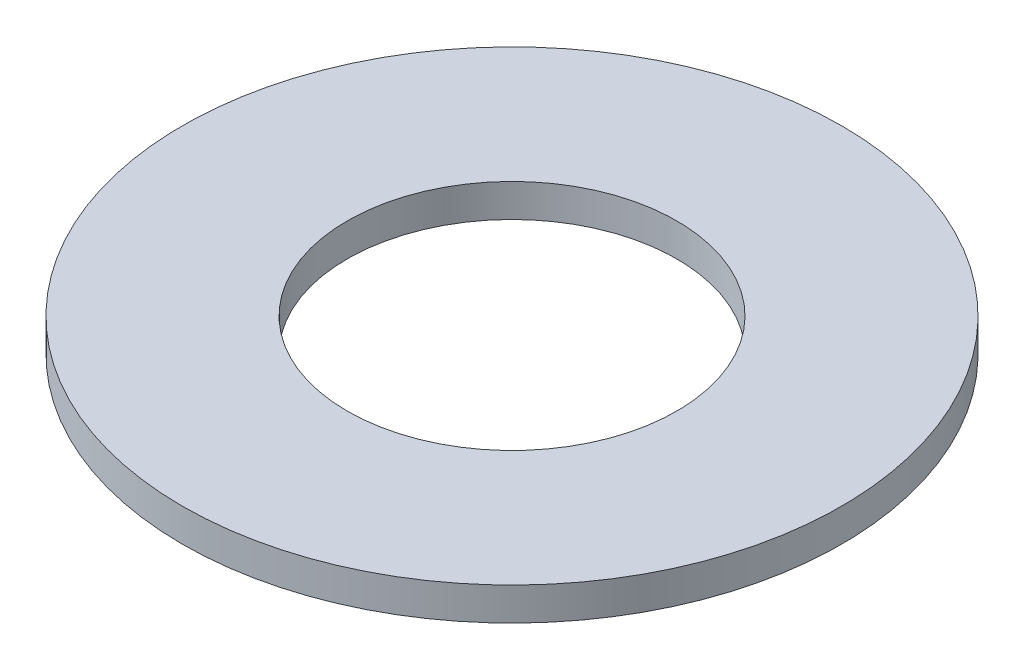
ISO-10303-21;
HEADER;
FILE_DESCRIPTION(('STEP AP214'),'2;1');
FILE_NAME('part.step','',(''),(''),'','','');
FILE_SCHEMA(('AUTOMOTIVE_DESIGN { 1 0 10303 214 1 1 1 1 }'));
ENDSEC;
DATA;
#1=APPLICATION_CONTEXT('core data for automotive mechanical design processes');
#2=APPLICATION_PROTOCOL_DEFINITION('international standard','automotive_design',2000,#1);
#3=PRODUCT_CONTEXT('',#1,'mechanical');
#4=PRODUCT('Part','Part','',(#3));
#5=PRODUCT_RELATED_PRODUCT_CATEGORY('part','',(#4));
#6=PRODUCT_DEFINITION_FORMATION('','',#4);
#7=PRODUCT_DEFINITION_CONTEXT('part definition',#1,'design');
#8=PRODUCT_DEFINITION('design','',#6,#7);
#9=PRODUCT_DEFINITION_SHAPE('','',#8);
#10=(LENGTH_UNIT() NAMED_UNIT(*) SI_UNIT(.MILLI.,.METRE.));
#11=(NAMED_UNIT(*) PLANE_ANGLE_UNIT() SI_UNIT($,.RADIAN.));
#12=(NAMED_UNIT(*) SI_UNIT($,.STERADIAN.) SOLID_ANGLE_UNIT());
#13=UNCERTAINTY_MEASURE_WITH_UNIT(LENGTH_MEASURE(1.E-05),#10,'distance_accuracy_value','');
#14=(GEOMETRIC_REPRESENTATION_CONTEXT(3) GLOBAL_UNCERTAINTY_ASSIGNED_CONTEXT((#13)) GLOBAL_UNIT_ASSIGNED_CONTEXT((#10,
#11,#12)) REPRESENTATION_CONTEXT('',''));
#15=CARTESIAN_POINT('',(0.,0.,0.));
#16=DIRECTION('',(0.,0.,1.));
#17=DIRECTION('',(1.,0.,0.));
#18=AXIS2_PLACEMENT_3D('',#15,#16,#17);
#19=CARTESIAN_POINT('',(0.,0.5,0.));
#20=DIRECTION('',(0.,1.,0.));
#21=DIRECTION('',(0.,0.,1.));
#22=AXIS2_PLACEMENT_3D('',#19,#20,#21);
#23=PLANE('',#22);
#24=CARTESIAN_POINT('',(0.,0.5,0.));
#25=DIRECTION('',(0.,1.,0.));
#26=DIRECTION('',(0.,0.,1.));
#27=AXIS2_PLACEMENT_3D('',#24,#25,#26);
#28=CIRCLE('',#27,5.);
#29=CARTESIAN_POINT('',(0.,0.5,5.));
#30=VERTEX_POINT('',#29);
#31=EDGE_CURVE('E10',#30,#30,#28,.T.);
#32=ORIENTED_EDGE('',*,*,#31,.T.);
#33=EDGE_LOOP('',(#32));
#34=FACE_BOUND('',#33,.T.);
#35=CARTESIAN_POINT('',(0.,0.5,0.));
#36=DIRECTION('',(0.,1.,0.));
#37=DIRECTION('',(0.,0.,1.));
#38=AXIS2_PLACEMENT_3D('',#35,#36,#37);
#39=CIRCLE('',#38,2.5);
#40=CARTESIAN_POINT('',(0.,0.5,2.5));
#41=VERTEX_POINT('',#40);
#42=EDGE_CURVE('E45',#41,#41,#39,.T.);
#43=ORIENTED_EDGE('',*,*,#42,.F.);
#44=EDGE_LOOP('',(#43));
#45=FACE_BOUND('',#44,.T.);
#46=ADVANCED_FACE('F34',(#34,#45),#23,.T.);
#47=CARTESIAN_POINT('',(0.,0.,0.));
#48=DIRECTION('',(0.,1.,0.));
#49=DIRECTION('',(0.,0.,1.));
#50=AXIS2_PLACEMENT_3D('',#47,#48,#49);
#51=PLANE('',#50);
#52=CARTESIAN_POINT('',(0.,0.,0.));
#53=DIRECTION('',(0.,1.,0.));
#54=DIRECTION('',(0.,0.,1.));
#55=AXIS2_PLACEMENT_3D('',#52,#53,#54);
#56=CIRCLE('',#55,5.);
#57=CARTESIAN_POINT('',(0.,0.,5.));
#58=VERTEX_POINT('',#57);
#59=EDGE_CURVE('E38',#58,#58,#56,.T.);
#60=ORIENTED_EDGE('',*,*,#59,.F.);
#61=EDGE_LOOP('',(#60));
#62=FACE_BOUND('',#61,.T.);
#63=CARTESIAN_POINT('',(0.,0.,0.));
#64=DIRECTION('',(0.,1.,0.));
#65=DIRECTION('',(0.,0.,1.));
#66=AXIS2_PLACEMENT_3D('',#63,#64,#65);
#67=CIRCLE('',#66,2.5);
#68=CARTESIAN_POINT('',(0.,0.,2.5));
#69=VERTEX_POINT('',#68);
#70=EDGE_CURVE('E47',#69,#69,#67,.T.);
#71=ORIENTED_EDGE('',*,*,#70,.T.);
#72=EDGE_LOOP('',(#71));
#73=FACE_BOUND('',#72,.T.);
#74=ADVANCED_FACE('F57',(#62,#73),#51,.F.);
#75=CARTESIAN_POINT('',(0.,0.5,0.));
#76=DIRECTION('',(0.,-1.,0.));
#77=DIRECTION('',(0.,0.,-1.));
#78=AXIS2_PLACEMENT_3D('',#75,#76,#77);
#79=CYLINDRICAL_SURFACE('',#78,5.);
#80=ORIENTED_EDGE('',*,*,#31,.F.);
#81=EDGE_LOOP('',(#80));
#82=FACE_BOUND('',#81,.T.);
#83=ORIENTED_EDGE('',*,*,#59,.T.);
#84=EDGE_LOOP('',(#83));
#85=FACE_BOUND('',#84,.T.);
#86=ADVANCED_FACE('F36',(#82,#85),#79,.T.);
#87=CARTESIAN_POINT('',(0.,0.5,0.));
#88=DIRECTION('',(0.,-1.,0.));
#89=DIRECTION('',(0.,0.,-1.));
#90=AXIS2_PLACEMENT_3D('',#87,#88,#89);
#91=CYLINDRICAL_SURFACE('',#90,2.5);
#92=ORIENTED_EDGE('',*,*,#42,.T.);
#93=EDGE_LOOP('',(#92));
#94=FACE_BOUND('',#93,.T.);
#95=ORIENTED_EDGE('',*,*,#70,.F.);
#96=EDGE_LOOP('',(#95));
#97=FACE_BOUND('',#96,.T.);
#98=ADVANCED_FACE('F53',(#94,#97),#91,.F.);
#99=CLOSED_SHELL('',(#46,#74,#86,#98));
#100=MANIFOLD_SOLID_BREP('B2',#99);
#101=ADVANCED_BREP_SHAPE_REPRESENTATION('',(#18,#100),#14);
#102=SHAPE_DEFINITION_REPRESENTATION(#9,#101);
ENDSEC;
END-ISO-10303-21;
